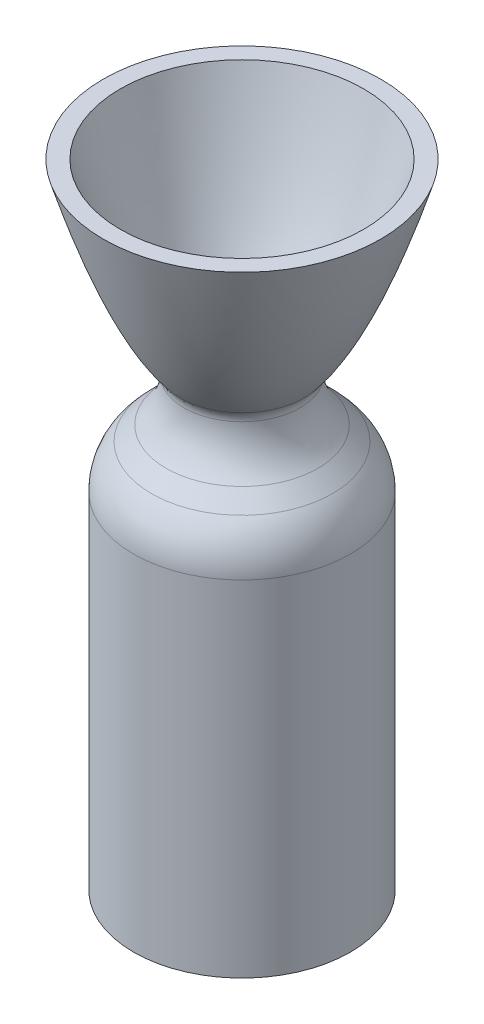
ISO-10303-21;
HEADER;
FILE_DESCRIPTION(('STEP AP214'),'2;1');
FILE_NAME('part.step','',(''),(''),'','','');
FILE_SCHEMA(('AUTOMOTIVE_DESIGN { 1 0 10303 214 1 1 1 1 }'));
ENDSEC;
DATA;
#1=APPLICATION_CONTEXT('core data for automotive mechanical design processes');
#2=APPLICATION_PROTOCOL_DEFINITION('international standard','automotive_design',2000,#1);
#3=PRODUCT_CONTEXT('',#1,'mechanical');
#4=PRODUCT('Part','Part','',(#3));
#5=PRODUCT_RELATED_PRODUCT_CATEGORY('part','',(#4));
#6=PRODUCT_DEFINITION_FORMATION('','',#4);
#7=PRODUCT_DEFINITION_CONTEXT('part definition',#1,'design');
#8=PRODUCT_DEFINITION('design','',#6,#7);
#9=PRODUCT_DEFINITION_SHAPE('','',#8);
#10=(LENGTH_UNIT() NAMED_UNIT(*) SI_UNIT(.MILLI.,.METRE.));
#11=(NAMED_UNIT(*) PLANE_ANGLE_UNIT() SI_UNIT($,.RADIAN.));
#12=(NAMED_UNIT(*) SI_UNIT($,.STERADIAN.) SOLID_ANGLE_UNIT());
#13=UNCERTAINTY_MEASURE_WITH_UNIT(LENGTH_MEASURE(1.E-05),#10,'distance_accuracy_value','');
#14=(GEOMETRIC_REPRESENTATION_CONTEXT(3) GLOBAL_UNCERTAINTY_ASSIGNED_CONTEXT((#13)) GLOBAL_UNIT_ASSIGNED_CONTEXT((#10,
#11,#12)) REPRESENTATION_CONTEXT('',''));
#15=CARTESIAN_POINT('',(0.,0.,0.));
#16=DIRECTION('',(0.,0.,1.));
#17=DIRECTION('',(1.,0.,0.));
#18=AXIS2_PLACEMENT_3D('',#15,#16,#17);
#19=CARTESIAN_POINT('',(26.7952792027515,6.50940032260474,0.));
#20=CARTESIAN_POINT('',(26.7445202608299,6.45863951351332,0.));
#21=CARTESIAN_POINT('',(26.6704420701971,6.38228245128605,0.));
#22=CARTESIAN_POINT('',(26.5045552478771,6.2088023183781,0.));
#23=CARTESIAN_POINT('',(26.3663457558084,6.0501123088261,0.));
#24=CARTESIAN_POINT('',(26.1788763741962,5.83307431955689,0.));
#25=CARTESIAN_POINT('',(26.0044054743904,5.61088821502492,0.));
#26=CARTESIAN_POINT('',(25.7917882699891,5.32567960819241,0.));
#27=CARTESIAN_POINT('',(25.6025147209982,5.0458645334822,0.));
#28=CARTESIAN_POINT('',(25.41648850457,4.75146224774109,0.));
#29=CARTESIAN_POINT('',(25.2460122224941,4.45494379501456,0.));
#30=CARTESIAN_POINT('',(25.0840703005529,4.14944285659226,0.));
#31=CARTESIAN_POINT('',(24.935285976811,3.8398274049797,0.));
#32=CARTESIAN_POINT('',(24.7971967711735,3.52378782945289,0.));
#33=CARTESIAN_POINT('',(24.6716190705559,3.20350771325653,0.));
#34=CARTESIAN_POINT('',(24.5577414131155,2.87825331698411,0.));
#35=CARTESIAN_POINT('',(24.4563235712815,2.54940009295196,0.));
#36=CARTESIAN_POINT('',(24.3671416013245,2.21651509223236,0.));
#37=CARTESIAN_POINT('',(24.2905437014453,1.88115744920019,0.));
#38=CARTESIAN_POINT('',(24.2264993053653,1.54221117006489,0.));
#39=CARTESIAN_POINT('',(24.1751847188441,1.20269794512489,0.));
#40=CARTESIAN_POINT('',(24.1414350870908,0.90159400009664,0.));
#41=CARTESIAN_POINT('',(24.1205335987741,0.646924938525799,0.));
#42=CARTESIAN_POINT('',(24.1084615678794,0.427224789349872,0.));
#43=CARTESIAN_POINT('',(24.1020237227721,0.267801741635842,0.));
#44=CARTESIAN_POINT('',(24.099606331446,0.110274361763279,0.));
#45=CARTESIAN_POINT('',(24.0990685004946,0.0360533244193808,0.));
#46=CARTESIAN_POINT('',(24.0990678740505,0.000160672239889663,0.));
#47=B_SPLINE_CURVE_WITH_KNOTS('',4,(#19,#20,#21,#22,#23,#24,#25,#26,#27,#28,#29,#30,#31,#32,#33,
#34,#35,#36,#37,#38,#39,#40,#41,#42,#43,#44,#45,#46),.UNSPECIFIED.,.F.,.F.,(5,1,1,1,1,1,1,1,1,1,
1,1,1,1,1,1,1,1,1,1,1,1,1,1,5),(0.0825688161645696,0.122284452541055,0.142142270729318,
0.162000088917581,0.201715725294151,0.241431361670644,0.281146998047181,0.320862634423759,
0.360578270800262,0.400293907176806,0.440009543553384,0.479725179929891,0.519440816306429,
0.55915645268299,0.598872089059496,0.638587725436031,0.678303361812587,0.718018998189109,
0.75773463456565,0.797450270942201,0.837165907318734,0.857023725507005,0.876881543695275,
0.896739361883545,0.916597180071815),.UNSPECIFIED.);
#48=CARTESIAN_POINT('',(-0.00553212594954357,165.815985113531,0.));
#49=DIRECTION('',(0.,1.,0.));
#50=AXIS1_PLACEMENT('',#48,#49);
#51=SURFACE_OF_REVOLUTION('',#47,#50);
#52=CARTESIAN_POINT('',(-0.00553212594953341,0.000160669552357051,0.));
#53=DIRECTION('',(0.,1.,0.));
#54=DIRECTION('',(-1.,0.,0.));
#55=AXIS2_PLACEMENT_3D('',#52,#53,#54);
#56=CIRCLE('',#55,24.1046);
#57=CARTESIAN_POINT('',(-24.1101321259496,0.000160669552355575,0.));
#58=VERTEX_POINT('',#57);
#59=EDGE_CURVE('E10',#58,#58,#56,.T.);
#60=ORIENTED_EDGE('',*,*,#59,.F.);
#61=EDGE_LOOP('',(#60));
#62=FACE_BOUND('',#61,.T.);
#63=CARTESIAN_POINT('',(-0.00553212594953381,6.5094003226005,0.));
#64=DIRECTION('',(0.,1.,0.));
#65=DIRECTION('',(-1.,0.,0.));
#66=AXIS2_PLACEMENT_3D('',#63,#64,#65);
#67=CIRCLE('',#66,26.8008113287013);
#68=CARTESIAN_POINT('',(-26.8063434546508,6.5094003226005,0.));
#69=VERTEX_POINT('',#68);
#70=EDGE_CURVE('E82',#69,#69,#67,.T.);
#71=ORIENTED_EDGE('',*,*,#70,.T.);
#72=EDGE_LOOP('',(#71));
#73=FACE_BOUND('',#72,.T.);
#74=ADVANCED_FACE('F35',(#62,#73),#51,.T.);
#75=CARTESIAN_POINT('',(24.0990678740505,0.000160669552358332,0.));
#76=CARTESIAN_POINT('',(24.0990691047249,-0.0703679729897621,0.));
#77=CARTESIAN_POINT('',(24.0995982518194,-0.213423515619133,0.));
#78=CARTESIAN_POINT('',(24.1019739368443,-0.54302224181822,0.));
#79=CARTESIAN_POINT('',(24.10829833089,-0.823999722559446,0.));
#80=CARTESIAN_POINT('',(24.1177834517884,-1.1946613974863,0.));
#81=CARTESIAN_POINT('',(24.1304257444452,-1.51327438410843,0.));
#82=CARTESIAN_POINT('',(24.1462259681743,-1.86177892905434,0.));
#83=CARTESIAN_POINT('',(24.1651812265105,-2.1935461976294,0.));
#84=CARTESIAN_POINT('',(24.1928188404359,-2.61790872582505,0.));
#85=CARTESIAN_POINT('',(24.2322870469037,-3.12187327281703,0.));
#86=CARTESIAN_POINT('',(24.3032997068499,-3.879818001106,0.));
#87=CARTESIAN_POINT('',(24.4231266777121,-4.88628971467499,0.));
#88=CARTESIAN_POINT('',(24.5994860435176,-6.05655008728183,0.));
#89=CARTESIAN_POINT('',(24.8508852325532,-7.38500574234499,0.));
#90=CARTESIAN_POINT('',(25.151795312904,-8.70341384276346,0.));
#91=CARTESIAN_POINT('',(25.5017706229282,-10.009476537691,0.));
#92=CARTESIAN_POINT('',(25.900360983004,-11.301658926675,0.));
#93=CARTESIAN_POINT('',(26.3469453913089,-12.5779386659632,0.));
#94=CARTESIAN_POINT('',(26.8410033222605,-13.8367268161605,0.));
#95=CARTESIAN_POINT('',(27.3816731213875,-15.0760364622051,0.));
#96=CARTESIAN_POINT('',(27.9684793861043,-16.2944491285472,0.));
#97=CARTESIAN_POINT('',(28.6001393971669,-17.4897781301292,0.));
#98=CARTESIAN_POINT('',(29.2765323953946,-18.6611270947939,0.));
#99=CARTESIAN_POINT('',(29.9954451013938,-19.8055827359117,0.));
#100=CARTESIAN_POINT('',(30.7580219989516,-20.923699415948,0.));
#101=CARTESIAN_POINT('',(31.4591671921531,-21.8742511030797,0.));
#102=CARTESIAN_POINT('',(32.0887361225265,-22.6732848247421,0.));
#103=CARTESIAN_POINT('',(32.6241284159213,-23.320261483749,0.));
#104=CARTESIAN_POINT('',(33.0722557675882,-23.8398443630674,0.));
#105=CARTESIAN_POINT('',(33.5084500256257,-24.3296555938153,0.));
#106=CARTESIAN_POINT('',(33.935826120804,-24.7883237383678,0.));
#107=CARTESIAN_POINT('',(34.2455586392244,-25.1137076595135,0.));
#108=CARTESIAN_POINT('',(34.536859957021,-25.4094883968146,0.));
#109=CARTESIAN_POINT('',(34.6364124249725,-25.5097892823287,0.));
#110=CARTESIAN_POINT('',(34.6862828026804,-25.5596614674385,0.));
#111=B_SPLINE_CURVE_WITH_KNOTS('',4,(#75,#76,#77,#78,#79,#80,#81,#82,#83,#84,#85,#86,#87,#88,
#89,#90,#91,#92,#93,#94,#95,#96,#97,#98,#99,#100,#101,#102,#103,#104,#105,#106,#107,#108,#109,
#110),.UNSPECIFIED.,.F.,.F.,(5,1,1,1,1,1,1,1,1,1,1,1,1,1,1,1,1,1,1,1,1,1,1,1,1,1,1,1,1,1,1,1,5),
(0.0826377294226478,0.0925749264345495,0.10251212335078,0.11244932026701,0.122386517183241,
0.132323714099471,0.142260911015702,0.152198107931932,0.162135304848163,0.182009698680624,
0.201884092513085,0.241632880178006,0.281381667842927,0.321130455507848,0.360879243172768,
0.400628030837689,0.44037681850261,0.480125606167531,0.519874393832452,0.559623181497373,
0.599371969162294,0.639120756827214,0.678869544492136,0.718618332157059,0.758367119821983,
0.798115907486907,0.817990301319368,0.837864695151829,0.857739088984291,0.877613482816753,
0.897487876649217,0.907425073565449,0.917362270383724),.UNSPECIFIED.);
#112=CARTESIAN_POINT('',(-0.00553212594954357,165.815985113531,0.));
#113=DIRECTION('',(0.,1.,0.));
#114=AXIS1_PLACEMENT('',#112,#113);
#115=SURFACE_OF_REVOLUTION('',#111,#114);
#116=CARTESIAN_POINT('',(-0.00553212594953185,-25.5596614655477,0.));
#117=DIRECTION('',(0.,1.,0.));
#118=DIRECTION('',(-1.,0.,0.));
#119=AXIS2_PLACEMENT_3D('',#116,#117,#118);
#120=CIRCLE('',#119,34.6918149267067);
#121=CARTESIAN_POINT('',(-34.6973470526563,-25.5596614655477,0.));
#122=VERTEX_POINT('',#121);
#123=EDGE_CURVE('E42',#122,#122,#120,.T.);
#124=ORIENTED_EDGE('',*,*,#123,.F.);
#125=EDGE_LOOP('',(#124));
#126=FACE_BOUND('',#125,.T.);
#127=ORIENTED_EDGE('',*,*,#59,.T.);
#128=EDGE_LOOP('',(#127));
#129=FACE_BOUND('',#128,.T.);
#130=ADVANCED_FACE('F164',(#126,#129),#115,.T.);
#131=CARTESIAN_POINT('',(-0.00553212594953185,-25.5596614655477,0.));
#132=DIRECTION('',(0.,-1.,0.));
#133=DIRECTION('',(1.,0.,0.));
#134=AXIS2_PLACEMENT_3D('',#131,#132,#133);
#135=CONICAL_SURFACE('',#134,34.6918149267067,0.785398163415759);
#136=CARTESIAN_POINT('',(-0.00553212594953132,-34.1672896585858,0.));
#137=DIRECTION('',(0.,1.,0.));
#138=DIRECTION('',(-1.,0.,0.));
#139=AXIS2_PLACEMENT_3D('',#136,#137,#138);
#140=CIRCLE('',#139,43.2994431200601);
#141=CARTESIAN_POINT('',(-43.3049752460096,-34.1672896585858,0.));
#142=VERTEX_POINT('',#141);
#143=EDGE_CURVE('E46',#142,#142,#140,.T.);
#144=ORIENTED_EDGE('',*,*,#143,.F.);
#145=EDGE_LOOP('',(#144));
#146=FACE_BOUND('',#145,.T.);
#147=ORIENTED_EDGE('',*,*,#123,.T.);
#148=EDGE_LOOP('',(#147));
#149=FACE_BOUND('',#148,.T.);
#150=ADVANCED_FACE('F161',(#146,#149),#135,.F.);
#151=CARTESIAN_POINT('',(43.2939109941105,-34.1672896585858,0.));
#152=CARTESIAN_POINT('',(43.3437831531247,-34.2171620573452,0.));
#153=CARTESIAN_POINT('',(43.4443920745444,-34.3185162898333,0.));
#154=CARTESIAN_POINT('',(43.6740724083412,-34.5515494530244,0.));
#155=CARTESIAN_POINT('',(43.8739246260564,-34.7603401533608,0.));
#156=CARTESIAN_POINT('',(44.1814575046805,-35.0846311873782,0.));
#157=CARTESIAN_POINT('',(44.5147761915075,-35.4469926594359,0.));
#158=CARTESIAN_POINT('',(44.9151269498929,-35.8942476348969,0.));
#159=CARTESIAN_POINT('',(45.3528176822085,-36.4033812844029,0.));
#160=CARTESIAN_POINT('',(45.8935379388954,-37.0556721248565,0.));
#161=CARTESIAN_POINT('',(46.5198690619119,-37.8514517874715,0.));
#162=CARTESIAN_POINT('',(47.2231021394871,-38.8040762415524,0.));
#163=CARTESIAN_POINT('',(47.9844755210263,-39.920972659652,0.));
#164=CARTESIAN_POINT('',(48.7041252301202,-41.0661548815019,0.));
#165=CARTESIAN_POINT('',(49.380120231768,-42.2370932415692,0.));
#166=CARTESIAN_POINT('',(50.0120609288654,-43.4327015285462,0.));
#167=CARTESIAN_POINT('',(50.5987337536069,-44.6509688062818,0.));
#168=CARTESIAN_POINT('',(51.1395203618712,-45.8904084081374,0.));
#169=CARTESIAN_POINT('',(51.6335378317996,-47.1491350698839,0.));
#170=CARTESIAN_POINT('',(52.0243487399805,-48.2659692264626,0.));
#171=CARTESIAN_POINT('',(52.3292893409879,-49.2330777430518,0.));
#172=CARTESIAN_POINT('',(52.610014224944,-50.207489041067,0.));
#173=CARTESIAN_POINT('',(52.866375120831,-51.1885390862781,0.));
#174=CARTESIAN_POINT('',(53.0920641873979,-52.1774428242253,0.));
#175=CARTESIAN_POINT('',(53.2868108226242,-53.172425242702,0.));
#176=CARTESIAN_POINT('',(53.4566757866814,-54.1724354331549,0.));
#177=CARTESIAN_POINT('',(53.5774268616838,-55.0081658633053,0.));
#178=CARTESIAN_POINT('',(53.6772884519765,-55.8484803687331,0.));
#179=CARTESIAN_POINT('',(53.7561931216229,-56.687998168099,0.));
#180=CARTESIAN_POINT('',(53.8004052848015,-57.2809599020668,0.));
#181=CARTESIAN_POINT('',(53.8304176257257,-57.7815944455847,0.));
#182=CARTESIAN_POINT('',(53.8501684534795,-58.2128376246677,0.));
#183=CARTESIAN_POINT('',(53.8628113510156,-58.532567490601,0.));
#184=CARTESIAN_POINT('',(53.8722968380644,-58.9047954955924,0.));
#185=CARTESIAN_POINT('',(53.8786214369048,-59.1815646193697,0.));
#186=CARTESIAN_POINT('',(53.8809972871594,-59.5154061058405,0.));
#187=CARTESIAN_POINT('',(53.8815264301164,-59.6569831594961,0.));
#188=CARTESIAN_POINT('',(53.881527661459,-59.7275132126737,0.));
#189=B_SPLINE_CURVE_WITH_KNOTS('',4,(#151,#152,#153,#154,#155,#156,#157,#158,#159,#160,#161,
#162,#163,#164,#165,#166,#167,#168,#169,#170,#171,#172,#173,#174,#175,#176,#177,#178,#179,#180,
#181,#182,#183,#184,#185,#186,#187,#188),.UNSPECIFIED.,.F.,.F.,(5,1,1,1,1,1,1,1,1,1,1,1,1,1,1,1,
1,1,1,1,1,1,1,1,1,1,1,1,1,1,1,1,1,1,5),(0.0826377291749007,0.0925749257522058,0.102512122668438,
0.11244931958467,0.122386516500903,0.142260910333363,0.162135304165824,0.182009697998285,
0.201884091830746,0.241632879495667,0.281381667160589,0.321130454825511,0.360879242490432,
0.400628030155354,0.440376817820275,0.480125605485197,0.519874393150118,0.559623180815039,
0.599371968479961,0.619246362312422,0.639120756144883,0.678869543809804,0.718618331474726,
0.738492725307186,0.758367119139647,0.798115906804568,0.817990300637029,0.83786469446949,
0.857739088301951,0.867676285218182,0.877613482134412,0.887550679050643,0.897487875966873,
0.907425072883103,0.91736227014275),.UNSPECIFIED.);
#190=CARTESIAN_POINT('',(-0.00553212594954357,165.815985113531,0.));
#191=DIRECTION('',(0.,1.,0.));
#192=AXIS1_PLACEMENT('',#190,#191);
#193=SURFACE_OF_REVOLUTION('',#189,#192);
#194=CARTESIAN_POINT('',(-0.00553212594952976,-59.7275132223151,0.));
#195=DIRECTION('',(0.,1.,0.));
#196=DIRECTION('',(-1.,0.,0.));
#197=AXIS2_PLACEMENT_3D('',#194,#195,#196);
#198=CIRCLE('',#197,53.8870597874087);
#199=CARTESIAN_POINT('',(-53.8925919133582,-59.7275132223151,0.));
#200=VERTEX_POINT('',#199);
#201=EDGE_CURVE('E50',#200,#200,#198,.T.);
#202=ORIENTED_EDGE('',*,*,#201,.F.);
#203=EDGE_LOOP('',(#202));
#204=FACE_BOUND('',#203,.T.);
#205=ORIENTED_EDGE('',*,*,#143,.T.);
#206=EDGE_LOOP('',(#205));
#207=FACE_BOUND('',#206,.T.);
#208=ADVANCED_FACE('F157',(#204,#207),#193,.T.);
#209=CARTESIAN_POINT('',(-0.00553212594954357,165.815985113531,0.));
#210=DIRECTION('',(0.,1.,0.));
#211=DIRECTION('',(-1.,0.,0.));
#212=AXIS2_PLACEMENT_3D('',#209,#210,#211);
#213=CYLINDRICAL_SURFACE('',#212,53.8870597874087);
#214=CARTESIAN_POINT('',(-0.00553212594951731,-262.927513222315,0.));
#215=DIRECTION('',(0.,1.,0.));
#216=DIRECTION('',(-1.,0.,0.));
#217=AXIS2_PLACEMENT_3D('',#214,#215,#216);
#218=CIRCLE('',#217,53.8870597874087);
#219=CARTESIAN_POINT('',(-53.8925919133582,-262.927513222315,0.));
#220=VERTEX_POINT('',#219);
#221=EDGE_CURVE('E55',#220,#220,#218,.T.);
#222=ORIENTED_EDGE('',*,*,#221,.F.);
#223=EDGE_LOOP('',(#222));
#224=FACE_BOUND('',#223,.T.);
#225=ORIENTED_EDGE('',*,*,#201,.T.);
#226=EDGE_LOOP('',(#225));
#227=FACE_BOUND('',#226,.T.);
#228=ADVANCED_FACE('F153',(#224,#227),#213,.F.);
#229=CARTESIAN_POINT('',(-0.00553212594951731,-262.927513222315,0.));
#230=DIRECTION('',(0.,-1.,0.));
#231=DIRECTION('',(1.,0.,0.));
#232=AXIS2_PLACEMENT_3D('',#229,#230,#231);
#233=CONICAL_SURFACE('',#232,53.8870597874087,1.56907929594439);
#234=CARTESIAN_POINT('',(-0.00553212594951731,-262.944683547694,0.));
#235=DIRECTION('',(0.,1.,0.));
#236=DIRECTION('',(-1.,0.,0.));
#237=AXIS2_PLACEMENT_3D('',#234,#235,#236);
#238=CIRCLE('',#237,63.8870597874079);
#239=CARTESIAN_POINT('',(-63.8925919133574,-262.944683547694,0.));
#240=VERTEX_POINT('',#239);
#241=EDGE_CURVE('E58',#240,#240,#238,.T.);
#242=ORIENTED_EDGE('',*,*,#241,.F.);
#243=EDGE_LOOP('',(#242));
#244=FACE_BOUND('',#243,.T.);
#245=ORIENTED_EDGE('',*,*,#221,.T.);
#246=EDGE_LOOP('',(#245));
#247=FACE_BOUND('',#246,.T.);
#248=ADVANCED_FACE('F149',(#244,#247),#233,.F.);
#249=CARTESIAN_POINT('',(-0.00553212594954357,165.815985113531,0.));
#250=DIRECTION('',(0.,1.,0.));
#251=DIRECTION('',(-1.,0.,0.));
#252=AXIS2_PLACEMENT_3D('',#249,#250,#251);
#253=CYLINDRICAL_SURFACE('',#252,63.8870597874157);
#254=CARTESIAN_POINT('',(-0.00553212594952975,-59.7610263903136,0.));
#255=DIRECTION('',(0.,1.,0.));
#256=DIRECTION('',(-1.,0.,0.));
#257=AXIS2_PLACEMENT_3D('',#254,#255,#256);
#258=CIRCLE('',#257,63.8870597874235);
#259=CARTESIAN_POINT('',(-63.892591913373,-59.7610263903136,0.));
#260=VERTEX_POINT('',#259);
#261=EDGE_CURVE('E61',#260,#260,#258,.T.);
#262=ORIENTED_EDGE('',*,*,#261,.F.);
#263=EDGE_LOOP('',(#262));
#264=FACE_BOUND('',#263,.T.);
#265=ORIENTED_EDGE('',*,*,#241,.T.);
#266=EDGE_LOOP('',(#265));
#267=FACE_BOUND('',#266,.T.);
#268=ADVANCED_FACE('F145',(#264,#267),#253,.T.);
#269=CARTESIAN_POINT('',(63.8815276614739,-59.7610263903136,0.));
#270=CARTESIAN_POINT('',(63.8816355026258,-59.6904964195703,0.));
#271=CARTESIAN_POINT('',(63.8813253047302,-59.5489187169074,0.));
#272=CARTESIAN_POINT('',(63.8794657326,-59.2150739554612,0.));
#273=CARTESIAN_POINT('',(63.8735691560049,-58.938295381848,0.));
#274=CARTESIAN_POINT('',(63.8646593191171,-58.5660531529552,0.));
#275=CARTESIAN_POINT('',(63.8525108888085,-58.2463041175089,0.));
#276=CARTESIAN_POINT('',(63.833426988588,-57.8150309100696,0.));
#277=CARTESIAN_POINT('',(63.8041888990146,-57.3143505520674,0.));
#278=CARTESIAN_POINT('',(63.7608937852421,-56.7213211544433,0.));
#279=CARTESIAN_POINT('',(63.6832874976312,-55.8816823353863,0.));
#280=CARTESIAN_POINT('',(63.5847255465146,-55.0412144020061,0.));
#281=CARTESIAN_POINT('',(63.4652670465404,-54.2052982334955,0.));
#282=CARTESIAN_POINT('',(63.2969487696863,-53.2050265480517,0.));
#283=CARTESIAN_POINT('',(63.103741076126,-52.2097441498556,0.));
#284=CARTESIAN_POINT('',(62.8795815877387,-51.2204925734304,0.));
#285=CARTESIAN_POINT('',(62.6247381612211,-50.2390472473377,0.));
#286=CARTESIAN_POINT('',(62.3455205091562,-49.2642029823664,0.));
#287=CARTESIAN_POINT('',(62.0420758754766,-48.2966240412494,0.));
#288=CARTESIAN_POINT('',(61.652992583265,-47.1791868434723,0.));
#289=CARTESIAN_POINT('',(61.160922284983,-45.9196977045217,0.));
#290=CARTESIAN_POINT('',(60.6220530774636,-44.679423275408,0.));
#291=CARTESIAN_POINT('',(60.0372649660084,-43.4602501835165,0.));
#292=CARTESIAN_POINT('',(59.4071739949165,-42.2636660499578,0.));
#293=CARTESIAN_POINT('',(58.732990620693,-41.0916836852225,0.));
#294=CARTESIAN_POINT('',(58.0151127601731,-39.9453899172837,0.));
#295=CARTESIAN_POINT('',(57.255467534001,-38.8273173949337,0.));
#296=CARTESIAN_POINT('',(56.553708500881,-37.8736065523072,0.));
#297=CARTESIAN_POINT('',(55.9286087748603,-37.0768592400309,0.));
#298=CARTESIAN_POINT('',(55.3888979118791,-36.4237329728274,0.));
#299=CARTESIAN_POINT('',(54.9519950620073,-35.9139230572821,0.));
#300=CARTESIAN_POINT('',(54.552336448006,-35.4660494868754,0.));
#301=CARTESIAN_POINT('',(54.2195785402934,-35.1031729813329,0.));
#302=CARTESIAN_POINT('',(53.9125475352232,-34.7784067452423,0.));
#303=CARTESIAN_POINT('',(53.7130184446919,-34.5693072294505,0.));
#304=CARTESIAN_POINT('',(53.4836987639478,-34.335919151556,0.));
#305=CARTESIAN_POINT('',(53.3832467039444,-34.2344094517556,0.));
#306=CARTESIAN_POINT('',(53.3334517306513,-34.1844599869187,0.));
#307=B_SPLINE_CURVE_WITH_KNOTS('',4,(#269,#270,#271,#272,#273,#274,#275,#276,#277,#278,#279,
#280,#281,#282,#283,#284,#285,#286,#287,#288,#289,#290,#291,#292,#293,#294,#295,#296,#297,#298,
#299,#300,#301,#302,#303,#304,#305,#306),.UNSPECIFIED.,.F.,.F.,(5,1,1,1,1,1,1,1,1,1,1,1,1,1,1,1,
1,1,1,1,1,1,1,1,1,1,1,1,1,1,1,1,1,1,5),(0.0826377291747779,0.0925749264345476,0.102512123350778,
0.112449320267009,0.122386517183239,0.132323714099469,0.1422609110157,0.162135304848161,
0.182009698680622,0.201884092513083,0.241632880178004,0.261507274010465,0.281381667842925,
0.321130455507847,0.360879243172768,0.380753637005229,0.40062803083769,0.440376818502612,
0.480125606167533,0.519874393832454,0.559623181497376,0.599371969162297,0.639120756827219,
0.67886954449214,0.718618332157062,0.758367119821984,0.798115907486905,0.817990301319366,
0.837864695151827,0.857739088984288,0.877613482816748,0.887550679732981,0.897487876649213,
0.907425073565445,0.917362270142754),.UNSPECIFIED.);
#308=CARTESIAN_POINT('',(-0.00553212594954357,165.815985113531,0.));
#309=DIRECTION('',(0.,1.,0.));
#310=AXIS1_PLACEMENT('',#308,#309);
#311=SURFACE_OF_REVOLUTION('',#307,#310);
#312=CARTESIAN_POINT('',(-0.00553212594953132,-34.1844599937652,0.));
#313=DIRECTION('',(0.,1.,0.));
#314=DIRECTION('',(-1.,0.,0.));
#315=AXIS2_PLACEMENT_3D('',#312,#313,#314);
#316=CIRCLE('',#315,53.3389838633626);
#317=CARTESIAN_POINT('',(-53.3445159893121,-34.1844599937652,0.));
#318=VERTEX_POINT('',#317);
#319=EDGE_CURVE('E64',#318,#318,#316,.T.);
#320=ORIENTED_EDGE('',*,*,#319,.F.);
#321=EDGE_LOOP('',(#320));
#322=FACE_BOUND('',#321,.T.);
#323=ORIENTED_EDGE('',*,*,#261,.T.);
#324=EDGE_LOOP('',(#323));
#325=FACE_BOUND('',#324,.T.);
#326=ADVANCED_FACE('F141',(#322,#325),#311,.T.);
#327=CARTESIAN_POINT('',(-0.00553212594953132,-34.1844599937652,0.));
#328=DIRECTION('',(0.,-1.,0.));
#329=DIRECTION('',(1.,0.,0.));
#330=AXIS2_PLACEMENT_3D('',#327,#328,#329);
#331=CONICAL_SURFACE('',#330,53.3389838633626,0.785398163410163);
#332=CARTESIAN_POINT('',(-0.00553212594953185,-25.5768317957809,0.));
#333=DIRECTION('',(0.,1.,0.));
#334=DIRECTION('',(-1.,0.,0.));
#335=AXIS2_PLACEMENT_3D('',#332,#333,#334);
#336=CIRCLE('',#335,44.7313556651593);
#337=CARTESIAN_POINT('',(-44.7368877911089,-25.5768317957809,0.));
#338=VERTEX_POINT('',#337);
#339=EDGE_CURVE('E67',#338,#338,#336,.T.);
#340=ORIENTED_EDGE('',*,*,#339,.F.);
#341=EDGE_LOOP('',(#340));
#342=FACE_BOUND('',#341,.T.);
#343=ORIENTED_EDGE('',*,*,#319,.T.);
#344=EDGE_LOOP('',(#343));
#345=FACE_BOUND('',#344,.T.);
#346=ADVANCED_FACE('F144',(#342,#345),#331,.T.);
#347=CARTESIAN_POINT('',(44.7258235392098,-25.5768317957808,0.));
#348=CARTESIAN_POINT('',(44.6759531614568,-25.5269596107162,0.));
#349=CARTESIAN_POINT('',(44.5764006934144,-25.4266587252923,0.));
#350=CARTESIAN_POINT('',(44.2850993753499,-25.1308779882551,0.));
#351=CARTESIAN_POINT('',(43.9753668566347,-24.80549406739,0.));
#352=CARTESIAN_POINT('',(43.547990761041,-24.3468259232245,0.));
#353=CARTESIAN_POINT('',(43.1117965025598,-23.8570146928717,0.));
#354=CARTESIAN_POINT('',(42.6636691504223,-23.3374318139592,0.));
#355=CARTESIAN_POINT('',(42.1282768564415,-22.6904551554372,0.));
#356=CARTESIAN_POINT('',(41.4987079253444,-21.8914214343451,0.));
#357=CARTESIAN_POINT('',(40.7975627312819,-20.9408697478485,0.));
#358=CARTESIAN_POINT('',(40.0349858327113,-19.8227530685029,0.));
#359=CARTESIAN_POINT('',(39.3160731256755,-18.6782974280363,0.));
#360=CARTESIAN_POINT('',(38.6396801263868,-17.5069484639843,0.));
#361=CARTESIAN_POINT('',(38.0080201142416,-16.3116194629743,0.));
#362=CARTESIAN_POINT('',(37.4212138484212,-15.0932067971638,0.));
#363=CARTESIAN_POINT('',(36.8805440481716,-13.8538971516089,0.));
#364=CARTESIAN_POINT('',(36.3864861160798,-12.5951090018591,0.));
#365=CARTESIAN_POINT('',(35.9399017066189,-11.3188292629754,0.));
#366=CARTESIAN_POINT('',(35.5413113453727,-10.0266468743525,0.));
#367=CARTESIAN_POINT('',(35.1913360341655,-8.7205841797419,0.));
#368=CARTESIAN_POINT('',(34.8904259526206,-7.40217607959599,0.));
#369=CARTESIAN_POINT('',(34.6390267623816,-6.07372042476053,0.));
#370=CARTESIAN_POINT('',(34.4626673955162,-4.90346005231344,0.));
#371=CARTESIAN_POINT('',(34.3428404237423,-3.89698833885298,0.));
#372=CARTESIAN_POINT('',(34.2718277631096,-3.13904361062833,0.));
#373=CARTESIAN_POINT('',(34.2323595561854,-2.63507906367211,0.));
#374=CARTESIAN_POINT('',(34.2047219418756,-2.21071653550148,0.));
#375=CARTESIAN_POINT('',(34.1857666832389,-1.87894926694359,0.));
#376=CARTESIAN_POINT('',(34.1699664591941,-1.530444722012,0.));
#377=CARTESIAN_POINT('',(34.1573241662487,-1.21183173540132,0.));
#378=CARTESIAN_POINT('',(34.1478390450145,-0.841170060483055,0.));
#379=CARTESIAN_POINT('',(34.1415146507144,-0.560192579747557,0.));
#380=CARTESIAN_POINT('',(34.1391389653909,-0.230593853550622,0.));
#381=CARTESIAN_POINT('',(34.1386098181668,-0.0875383109217305,0.));
#382=CARTESIAN_POINT('',(34.1386085874286,-0.0170096683796111,0.));
#383=B_SPLINE_CURVE_WITH_KNOTS('',4,(#347,#348,#349,#350,#351,#352,#353,#354,#355,#356,#357,
#358,#359,#360,#361,#362,#363,#364,#365,#366,#367,#368,#369,#370,#371,#372,#373,#374,#375,#376,
#377,#378,#379,#380,#381,#382),.UNSPECIFIED.,.F.,.F.,(5,1,1,1,1,1,1,1,1,1,1,1,1,1,1,1,1,1,1,1,1,
1,1,1,1,1,1,1,1,1,1,1,5),(0.0826377294226941,0.0925749262410036,0.102512123157236,
0.1223865169897,0.142260910822161,0.162135304654623,0.182009698487084,0.201884092319546,
0.241632879984469,0.281381667649393,0.321130455314316,0.360879242979238,0.400628030644159,
0.440376818309079,0.480125605974,0.519874393638921,0.559623181303842,0.599371968968764,
0.639120756633684,0.678869544298605,0.718618331963526,0.758367119628446,0.798115907293367,
0.817990301125828,0.83786469495829,0.84780189187452,0.857739088790751,0.867676285706981,
0.877613482623212,0.887550679539442,0.897487876455672,0.907425073371903,0.917362270383758),.UNSPECIFIED.);
#384=CARTESIAN_POINT('',(-0.00553212594954357,165.815985113531,0.));
#385=DIRECTION('',(0.,1.,0.));
#386=AXIS1_PLACEMENT('',#384,#385);
#387=SURFACE_OF_REVOLUTION('',#383,#386);
#388=CARTESIAN_POINT('',(-0.00553212594953341,-0.0170096656934016,0.));
#389=DIRECTION('',(0.,1.,0.));
#390=DIRECTION('',(-1.,0.,0.));
#391=AXIS2_PLACEMENT_3D('',#388,#389,#390);
#392=CIRCLE('',#391,34.1441407133781);
#393=CARTESIAN_POINT('',(-34.1496728393276,-0.0170096656934037,0.));
#394=VERTEX_POINT('',#393);
#395=EDGE_CURVE('E70',#394,#394,#392,.T.);
#396=ORIENTED_EDGE('',*,*,#395,.F.);
#397=EDGE_LOOP('',(#396));
#398=FACE_BOUND('',#397,.T.);
#399=ORIENTED_EDGE('',*,*,#339,.T.);
#400=EDGE_LOOP('',(#399));
#401=FACE_BOUND('',#400,.T.);
#402=ADVANCED_FACE('F112',(#398,#401),#387,.T.);
#403=CARTESIAN_POINT('',(34.1386085874285,-0.0170096656933947,0.));
#404=CARTESIAN_POINT('',(34.1386092138728,0.0188829864821757,0.));
#405=CARTESIAN_POINT('',(34.1391470448244,0.0931040238253054,0.));
#406=CARTESIAN_POINT('',(34.1415644361508,0.25063140368994,0.));
#407=CARTESIAN_POINT('',(34.1480022812581,0.410054451399113,0.));
#408=CARTESIAN_POINT('',(34.1600743121532,0.629754600575022,0.));
#409=CARTESIAN_POINT('',(34.1809758004702,0.88442366214583,0.));
#410=CARTESIAN_POINT('',(34.214725432224,1.18552760717403,0.));
#411=CARTESIAN_POINT('',(34.2660400187457,1.52504083211395,0.));
#412=CARTESIAN_POINT('',(34.3300844148262,1.86398711124915,0.));
#413=CARTESIAN_POINT('',(34.406682314706,2.19934475428121,0.));
#414=CARTESIAN_POINT('',(34.4958642846635,2.53222975500066,0.));
#415=CARTESIAN_POINT('',(34.597282126498,2.86108297903266,0.));
#416=CARTESIAN_POINT('',(34.7111597839388,3.1863373753049,0.));
#417=CARTESIAN_POINT('',(34.836737484557,3.50661749150107,0.));
#418=CARTESIAN_POINT('',(34.974826690195,3.82265706702767,0.));
#419=CARTESIAN_POINT('',(35.1236110139373,4.13227251864,0.));
#420=CARTESIAN_POINT('',(35.285552935879,4.43777345706205,0.));
#421=CARTESIAN_POINT('',(35.4560292179553,4.73429190978832,0.));
#422=CARTESIAN_POINT('',(35.642055434384,5.02869419552913,0.));
#423=CARTESIAN_POINT('',(35.8313289833754,5.30850927023906,0.));
#424=CARTESIAN_POINT('',(36.0439461877771,5.59371787707124,0.));
#425=CARTESIAN_POINT('',(36.2184170875833,5.81590398160294,0.));
#426=CARTESIAN_POINT('',(36.4058864691957,6.03294197087187,0.));
#427=CARTESIAN_POINT('',(36.5440959612636,6.19163198042227,0.));
#428=CARTESIAN_POINT('',(36.7099827835806,6.36511211332681,0.));
#429=CARTESIAN_POINT('',(36.784060974214,6.44146917555451,0.));
#430=CARTESIAN_POINT('',(36.8348199161343,6.49222998464454,0.));
#431=B_SPLINE_CURVE_WITH_KNOTS('',4,(#403,#404,#405,#406,#407,#408,#409,#410,#411,#412,#413,
#414,#415,#416,#417,#418,#419,#420,#421,#422,#423,#424,#425,#426,#427,#428,#429,#430),
.UNSPECIFIED.,.F.,.F.,(5,1,1,1,1,1,1,1,1,1,1,1,1,1,1,1,1,1,1,1,1,1,1,1,5),(0.0825688161645696,
0.102426634352839,0.122284452541109,0.14214227072938,0.16200008891765,0.201715725294183,
0.241431361670735,0.281146998047275,0.320862634423797,0.360578270800353,0.400293907176888,
0.440009543553394,0.479725179929955,0.519440816306493,0.559156452683,0.598872089059578,
0.638587725436122,0.678303361812625,0.718018998189203,0.75773463456574,0.797450270942234,
0.837165907318803,0.857023725507066,0.876881543695329,0.916597180071815),.UNSPECIFIED.);
#432=CARTESIAN_POINT('',(-0.00553212594954357,165.815985113531,0.));
#433=DIRECTION('',(0.,1.,0.));
#434=AXIS1_PLACEMENT('',#432,#433);
#435=SURFACE_OF_REVOLUTION('',#431,#434);
#436=CARTESIAN_POINT('',(-0.00553212594953381,6.49222998464255,0.));
#437=DIRECTION('',(0.,1.,0.));
#438=DIRECTION('',(-1.,0.,0.));
#439=AXIS2_PLACEMENT_3D('',#436,#437,#438);
#440=CIRCLE('',#439,36.8403520420818);
#441=CARTESIAN_POINT('',(-36.8458841680313,6.49222998464255,0.));
#442=VERTEX_POINT('',#441);
#443=EDGE_CURVE('E73',#442,#442,#440,.T.);
#444=ORIENTED_EDGE('',*,*,#443,.F.);
#445=EDGE_LOOP('',(#444));
#446=FACE_BOUND('',#445,.T.);
#447=ORIENTED_EDGE('',*,*,#395,.T.);
#448=EDGE_LOOP('',(#447));
#449=FACE_BOUND('',#448,.T.);
#450=ADVANCED_FACE('F108',(#446,#449),#435,.T.);
#451=CARTESIAN_POINT('',(36.8348199161323,6.49222998464254,0.));
#452=CARTESIAN_POINT('',(59.2901874443697,34.6275313961082,0.));
#453=CARTESIAN_POINT('',(81.727523602534,109.927507640393,0.));
#454=B_SPLINE_CURVE_WITH_KNOTS('',2,(#451,#452,#453),.UNSPECIFIED.,.F.,.F.,(3,3),(0.,1.),.UNSPECIFIED.);
#455=CARTESIAN_POINT('',(-0.00553212594954357,165.815985113531,0.));
#456=DIRECTION('',(0.,1.,0.));
#457=AXIS1_PLACEMENT('',#455,#456);
#458=SURFACE_OF_REVOLUTION('',#454,#457);
#459=CARTESIAN_POINT('',(-0.00553212594954014,109.927507640393,0.));
#460=DIRECTION('',(0.,1.,0.));
#461=DIRECTION('',(-1.,0.,0.));
#462=AXIS2_PLACEMENT_3D('',#459,#460,#461);
#463=CIRCLE('',#462,81.7330557284828);
#464=CARTESIAN_POINT('',(-81.7385878544323,109.927507640393,0.));
#465=VERTEX_POINT('',#464);
#466=EDGE_CURVE('E76',#465,#465,#463,.T.);
#467=ORIENTED_EDGE('',*,*,#466,.F.);
#468=EDGE_LOOP('',(#467));
#469=FACE_BOUND('',#468,.T.);
#470=ORIENTED_EDGE('',*,*,#443,.T.);
#471=EDGE_LOOP('',(#470));
#472=FACE_BOUND('',#471,.T.);
#473=ADVANCED_FACE('F104',(#469,#472),#458,.T.);
#474=CARTESIAN_POINT('',(71.7275236025332,109.927507640395,0.));
#475=DIRECTION('',(0.,-1.,0.));
#476=DIRECTION('',(1.,0.,0.));
#477=AXIS2_PLACEMENT_3D('',#474,#475,#476);
#478=PLANE('',#477);
#479=CARTESIAN_POINT('',(-0.00553212594954014,109.927507640397,0.));
#480=DIRECTION('',(0.,1.,0.));
#481=DIRECTION('',(-1.,0.,0.));
#482=AXIS2_PLACEMENT_3D('',#479,#480,#481);
#483=CIRCLE('',#482,71.7330557284846);
#484=CARTESIAN_POINT('',(-71.7385878544342,109.927507640397,0.));
#485=VERTEX_POINT('',#484);
#486=EDGE_CURVE('E79',#485,#485,#483,.T.);
#487=ORIENTED_EDGE('',*,*,#486,.F.);
#488=EDGE_LOOP('',(#487));
#489=FACE_BOUND('',#488,.T.);
#490=ORIENTED_EDGE('',*,*,#466,.T.);
#491=EDGE_LOOP('',(#490));
#492=FACE_BOUND('',#491,.T.);
#493=ADVANCED_FACE('F100',(#489,#492),#478,.F.);
#494=CARTESIAN_POINT('',(71.7275236025351,109.927507640397,0.));
#495=CARTESIAN_POINT('',(49.2614014026928,34.6361148417113,0.));
#496=CARTESIAN_POINT('',(26.7952792027517,6.5094003226005,0.));
#497=B_SPLINE_CURVE_WITH_KNOTS('',2,(#494,#495,#496),.UNSPECIFIED.,.F.,.F.,(3,3),(0.,1.),.UNSPECIFIED.);
#498=CARTESIAN_POINT('',(-0.00553212594954357,165.815985113531,0.));
#499=DIRECTION('',(0.,1.,0.));
#500=AXIS1_PLACEMENT('',#498,#499);
#501=SURFACE_OF_REVOLUTION('',#497,#500);
#502=ORIENTED_EDGE('',*,*,#70,.F.);
#503=EDGE_LOOP('',(#502));
#504=FACE_BOUND('',#503,.T.);
#505=ORIENTED_EDGE('',*,*,#486,.T.);
#506=EDGE_LOOP('',(#505));
#507=FACE_BOUND('',#506,.T.);
#508=ADVANCED_FACE('F97',(#504,#507),#501,.T.);
#509=CLOSED_SHELL('',(#74,#130,#150,#208,#228,#248,#268,#326,#346,#402,#450,#473,#493,#508));
#510=MANIFOLD_SOLID_BREP('B2',#509);
#511=ADVANCED_BREP_SHAPE_REPRESENTATION('',(#18,#510),#14);
#512=SHAPE_DEFINITION_REPRESENTATION(#9,#511);
ENDSEC;
END-ISO-10303-21;
